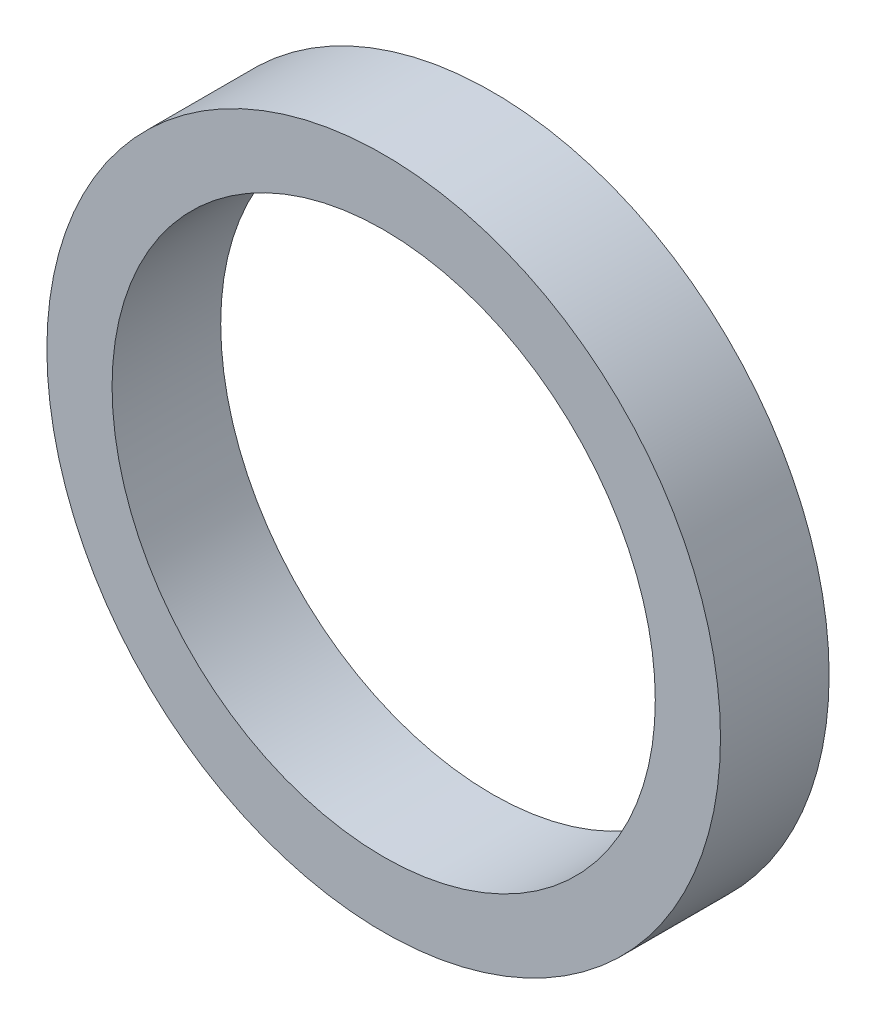
ISO-10303-21;
HEADER;
FILE_DESCRIPTION(('STEP AP214'),'2;1');
FILE_NAME('part.step','',(''),(''),'','','');
FILE_SCHEMA(('AUTOMOTIVE_DESIGN { 1 0 10303 214 1 1 1 1 }'));
ENDSEC;
DATA;
#1=APPLICATION_CONTEXT('core data for automotive mechanical design processes');
#2=APPLICATION_PROTOCOL_DEFINITION('international standard','automotive_design',2000,#1);
#3=PRODUCT_CONTEXT('',#1,'mechanical');
#4=PRODUCT('Part','Part','',(#3));
#5=PRODUCT_RELATED_PRODUCT_CATEGORY('part','',(#4));
#6=PRODUCT_DEFINITION_FORMATION('','',#4);
#7=PRODUCT_DEFINITION_CONTEXT('part definition',#1,'design');
#8=PRODUCT_DEFINITION('design','',#6,#7);
#9=PRODUCT_DEFINITION_SHAPE('','',#8);
#10=(LENGTH_UNIT() NAMED_UNIT(*) SI_UNIT(.MILLI.,.METRE.));
#11=(NAMED_UNIT(*) PLANE_ANGLE_UNIT() SI_UNIT($,.RADIAN.));
#12=(NAMED_UNIT(*) SI_UNIT($,.STERADIAN.) SOLID_ANGLE_UNIT());
#13=UNCERTAINTY_MEASURE_WITH_UNIT(LENGTH_MEASURE(1.E-05),#10,'distance_accuracy_value','');
#14=(GEOMETRIC_REPRESENTATION_CONTEXT(3) GLOBAL_UNCERTAINTY_ASSIGNED_CONTEXT((#13)) GLOBAL_UNIT_ASSIGNED_CONTEXT((#10,
#11,#12)) REPRESENTATION_CONTEXT('',''));
#15=CARTESIAN_POINT('',(0.,0.,0.));
#16=DIRECTION('',(0.,0.,1.));
#17=DIRECTION('',(1.,0.,0.));
#18=AXIS2_PLACEMENT_3D('',#15,#16,#17);
#19=CARTESIAN_POINT('',(0.,0.,-5.));
#20=DIRECTION('',(0.,0.,-1.));
#21=DIRECTION('',(1.,0.,0.));
#22=AXIS2_PLACEMENT_3D('',#19,#20,#21);
#23=PLANE('',#22);
#24=CARTESIAN_POINT('',(0.,0.,-5.));
#25=DIRECTION('',(0.,0.,1.));
#26=DIRECTION('',(1.,0.,0.));
#27=AXIS2_PLACEMENT_3D('',#24,#25,#26);
#28=CIRCLE('',#27,15.5);
#29=CARTESIAN_POINT('',(15.5,0.,-5.));
#30=VERTEX_POINT('',#29);
#31=EDGE_CURVE('E10',#30,#30,#28,.T.);
#32=ORIENTED_EDGE('',*,*,#31,.F.);
#33=EDGE_LOOP('',(#32));
#34=FACE_BOUND('',#33,.T.);
#35=CARTESIAN_POINT('',(0.,0.,-5.));
#36=DIRECTION('',(0.,0.,1.));
#37=DIRECTION('',(1.,0.,0.));
#38=AXIS2_PLACEMENT_3D('',#35,#36,#37);
#39=CIRCLE('',#38,12.5);
#40=CARTESIAN_POINT('',(12.5,0.,-5.));
#41=VERTEX_POINT('',#40);
#42=EDGE_CURVE('E46',#41,#41,#39,.T.);
#43=ORIENTED_EDGE('',*,*,#42,.T.);
#44=EDGE_LOOP('',(#43));
#45=FACE_BOUND('',#44,.T.);
#46=ADVANCED_FACE('F35',(#34,#45),#23,.T.);
#47=CARTESIAN_POINT('',(0.,0.,0.));
#48=DIRECTION('',(0.,0.,-1.));
#49=DIRECTION('',(1.,0.,0.));
#50=AXIS2_PLACEMENT_3D('',#47,#48,#49);
#51=PLANE('',#50);
#52=CARTESIAN_POINT('',(0.,0.,0.));
#53=DIRECTION('',(0.,0.,1.));
#54=DIRECTION('',(1.,0.,0.));
#55=AXIS2_PLACEMENT_3D('',#52,#53,#54);
#56=CIRCLE('',#55,15.5);
#57=CARTESIAN_POINT('',(15.5,0.,0.));
#58=VERTEX_POINT('',#57);
#59=EDGE_CURVE('E39',#58,#58,#56,.T.);
#60=ORIENTED_EDGE('',*,*,#59,.T.);
#61=EDGE_LOOP('',(#60));
#62=FACE_BOUND('',#61,.T.);
#63=CARTESIAN_POINT('',(0.,0.,0.));
#64=DIRECTION('',(0.,0.,1.));
#65=DIRECTION('',(1.,0.,0.));
#66=AXIS2_PLACEMENT_3D('',#63,#64,#65);
#67=CIRCLE('',#66,12.5);
#68=CARTESIAN_POINT('',(12.5,0.,0.));
#69=VERTEX_POINT('',#68);
#70=EDGE_CURVE('E48',#69,#69,#67,.T.);
#71=ORIENTED_EDGE('',*,*,#70,.F.);
#72=EDGE_LOOP('',(#71));
#73=FACE_BOUND('',#72,.T.);
#74=ADVANCED_FACE('F61',(#62,#73),#51,.F.);
#75=CARTESIAN_POINT('',(0.,0.,-5.));
#76=DIRECTION('',(0.,0.,1.));
#77=DIRECTION('',(-1.,0.,0.));
#78=AXIS2_PLACEMENT_3D('',#75,#76,#77);
#79=CYLINDRICAL_SURFACE('',#78,15.5);
#80=ORIENTED_EDGE('',*,*,#31,.T.);
#81=EDGE_LOOP('',(#80));
#82=FACE_BOUND('',#81,.T.);
#83=ORIENTED_EDGE('',*,*,#59,.F.);
#84=EDGE_LOOP('',(#83));
#85=FACE_BOUND('',#84,.T.);
#86=ADVANCED_FACE('F37',(#82,#85),#79,.T.);
#87=CARTESIAN_POINT('',(0.,0.,-5.));
#88=DIRECTION('',(0.,0.,1.));
#89=DIRECTION('',(-1.,0.,0.));
#90=AXIS2_PLACEMENT_3D('',#87,#88,#89);
#91=CYLINDRICAL_SURFACE('',#90,12.5);
#92=ORIENTED_EDGE('',*,*,#42,.F.);
#93=EDGE_LOOP('',(#92));
#94=FACE_BOUND('',#93,.T.);
#95=ORIENTED_EDGE('',*,*,#70,.T.);
#96=EDGE_LOOP('',(#95));
#97=FACE_BOUND('',#96,.T.);
#98=ADVANCED_FACE('F55',(#94,#97),#91,.F.);
#99=CLOSED_SHELL('',(#46,#74,#86,#98));
#100=MANIFOLD_SOLID_BREP('B2',#99);
#101=ADVANCED_BREP_SHAPE_REPRESENTATION('',(#18,#100),#14);
#102=SHAPE_DEFINITION_REPRESENTATION(#9,#101);
ENDSEC;
END-ISO-10303-21;
